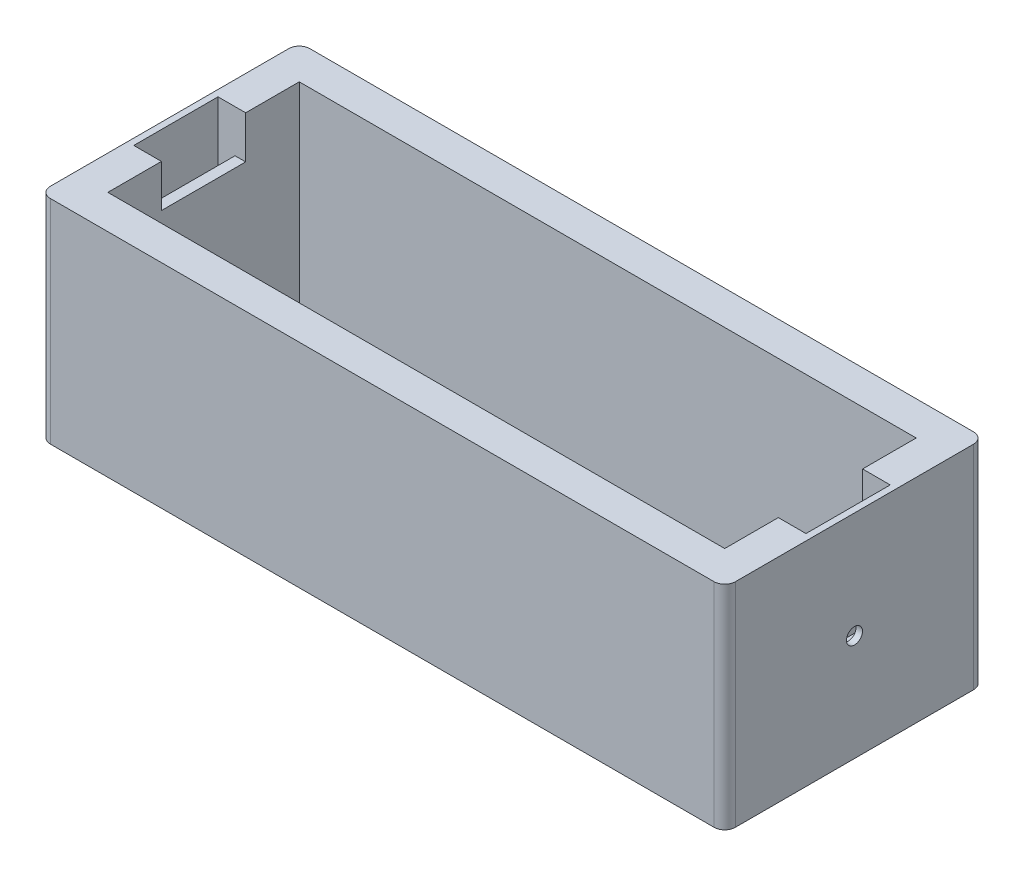
ISO-10303-21;
HEADER;
FILE_DESCRIPTION(('STEP AP214'),'2;1');
FILE_NAME('part.step','',(''),(''),'','','');
FILE_SCHEMA(('AUTOMOTIVE_DESIGN { 1 0 10303 214 1 1 1 1 }'));
ENDSEC;
DATA;
#1=APPLICATION_CONTEXT('core data for automotive mechanical design processes');
#2=APPLICATION_PROTOCOL_DEFINITION('international standard','automotive_design',2000,#1);
#3=PRODUCT_CONTEXT('',#1,'mechanical');
#4=PRODUCT('Part','Part','',(#3));
#5=PRODUCT_RELATED_PRODUCT_CATEGORY('part','',(#4));
#6=PRODUCT_DEFINITION_FORMATION('','',#4);
#7=PRODUCT_DEFINITION_CONTEXT('part definition',#1,'design');
#8=PRODUCT_DEFINITION('design','',#6,#7);
#9=PRODUCT_DEFINITION_SHAPE('','',#8);
#10=(LENGTH_UNIT() NAMED_UNIT(*) SI_UNIT(.MILLI.,.METRE.));
#11=(NAMED_UNIT(*) PLANE_ANGLE_UNIT() SI_UNIT($,.RADIAN.));
#12=(NAMED_UNIT(*) SI_UNIT($,.STERADIAN.) SOLID_ANGLE_UNIT());
#13=UNCERTAINTY_MEASURE_WITH_UNIT(LENGTH_MEASURE(1.E-05),#10,'distance_accuracy_value','');
#14=(GEOMETRIC_REPRESENTATION_CONTEXT(3) GLOBAL_UNCERTAINTY_ASSIGNED_CONTEXT((#13)) GLOBAL_UNIT_ASSIGNED_CONTEXT((#10,
#11,#12)) REPRESENTATION_CONTEXT('',''));
#15=CARTESIAN_POINT('',(0.,0.,0.));
#16=DIRECTION('',(0.,0.,1.));
#17=DIRECTION('',(1.,0.,0.));
#18=AXIS2_PLACEMENT_3D('',#15,#16,#17);
#19=CARTESIAN_POINT('',(0.,20.,0.));
#20=DIRECTION('',(0.,-1.,0.));
#21=DIRECTION('',(0.,0.,-1.));
#22=AXIS2_PLACEMENT_3D('',#19,#20,#21);
#23=PLANE('',#22);
#24=DIRECTION('',(-1.,0.,0.));
#25=VECTOR('',#24,1.);
#26=CARTESIAN_POINT('',(-32.2,20.,-12.2));
#27=LINE('',#26,#25);
#28=CARTESIAN_POINT('',(31.2,20.,-12.2));
#29=VERTEX_POINT('',#28);
#30=CARTESIAN_POINT('',(-31.2,20.,-12.2));
#31=VERTEX_POINT('',#30);
#32=EDGE_CURVE('E350',#29,#31,#27,.T.);
#33=ORIENTED_EDGE('',*,*,#32,.T.);
#34=CARTESIAN_POINT('',(-31.2,20.,-11.2));
#35=DIRECTION('',(0.,-1.,0.));
#36=DIRECTION('',(0.,0.,-1.));
#37=AXIS2_PLACEMENT_3D('',#34,#35,#36);
#38=CIRCLE('',#37,1.);
#39=CARTESIAN_POINT('',(-32.2,20.,-11.2));
#40=VERTEX_POINT('',#39);
#41=EDGE_CURVE('E392',#31,#40,#38,.F.);
#42=ORIENTED_EDGE('',*,*,#41,.T.);
#43=DIRECTION('',(0.,0.,1.));
#44=VECTOR('',#43,1.);
#45=CARTESIAN_POINT('',(-32.2,20.,12.2));
#46=LINE('',#45,#44);
#47=CARTESIAN_POINT('',(-32.2,20.,11.2));
#48=VERTEX_POINT('',#47);
#49=EDGE_CURVE('E354',#40,#48,#46,.T.);
#50=ORIENTED_EDGE('',*,*,#49,.T.);
#51=CARTESIAN_POINT('',(-31.2,20.,11.2));
#52=DIRECTION('',(0.,-1.,0.));
#53=DIRECTION('',(0.,0.,-1.));
#54=AXIS2_PLACEMENT_3D('',#51,#52,#53);
#55=CIRCLE('',#54,1.);
#56=CARTESIAN_POINT('',(-31.2,20.,12.2));
#57=VERTEX_POINT('',#56);
#58=EDGE_CURVE('E386',#48,#57,#55,.F.);
#59=ORIENTED_EDGE('',*,*,#58,.T.);
#60=DIRECTION('',(1.,0.,0.));
#61=VECTOR('',#60,1.);
#62=CARTESIAN_POINT('',(-32.2,20.,12.2));
#63=LINE('',#62,#61);
#64=CARTESIAN_POINT('',(31.2,20.,12.2));
#65=VERTEX_POINT('',#64);
#66=EDGE_CURVE('E357',#57,#65,#63,.T.);
#67=ORIENTED_EDGE('',*,*,#66,.T.);
#68=CARTESIAN_POINT('',(31.2,20.,11.2));
#69=DIRECTION('',(0.,-1.,0.));
#70=DIRECTION('',(0.,0.,-1.));
#71=AXIS2_PLACEMENT_3D('',#68,#69,#70);
#72=CIRCLE('',#71,1.);
#73=CARTESIAN_POINT('',(32.2,20.,11.2));
#74=VERTEX_POINT('',#73);
#75=EDGE_CURVE('E388',#65,#74,#72,.F.);
#76=ORIENTED_EDGE('',*,*,#75,.T.);
#77=DIRECTION('',(0.,0.,-1.));
#78=VECTOR('',#77,1.);
#79=CARTESIAN_POINT('',(32.2,20.,12.2));
#80=LINE('',#79,#78);
#81=CARTESIAN_POINT('',(32.2,20.,-11.2));
#82=VERTEX_POINT('',#81);
#83=EDGE_CURVE('E347',#74,#82,#80,.T.);
#84=ORIENTED_EDGE('',*,*,#83,.T.);
#85=CARTESIAN_POINT('',(31.2,20.,-11.2));
#86=DIRECTION('',(0.,-1.,0.));
#87=DIRECTION('',(0.,0.,-1.));
#88=AXIS2_PLACEMENT_3D('',#85,#86,#87);
#89=CIRCLE('',#88,1.);
#90=EDGE_CURVE('E390',#82,#29,#89,.F.);
#91=ORIENTED_EDGE('',*,*,#90,.T.);
#92=EDGE_LOOP('',(#33,#42,#50,#59,#67,#76,#84,#91));
#93=FACE_BOUND('',#92,.T.);
#94=DIRECTION('',(-1.,0.,0.));
#95=VECTOR('',#94,1.);
#96=CARTESIAN_POINT('',(-29.,20.,3.96));
#97=LINE('',#96,#95);
#98=CARTESIAN_POINT('',(-29.,20.,3.96));
#99=VERTEX_POINT('',#98);
#100=CARTESIAN_POINT('',(-31.6,20.,3.96));
#101=VERTEX_POINT('',#100);
#102=EDGE_CURVE('E241',#99,#101,#97,.T.);
#103=ORIENTED_EDGE('',*,*,#102,.T.);
#104=DIRECTION('',(0.,0.,1.));
#105=VECTOR('',#104,1.);
#106=CARTESIAN_POINT('',(-31.6,20.,0.));
#107=LINE('',#106,#105);
#108=CARTESIAN_POINT('',(-31.6,20.,-3.96));
#109=VERTEX_POINT('',#108);
#110=EDGE_CURVE('E284',#109,#101,#107,.T.);
#111=ORIENTED_EDGE('',*,*,#110,.F.);
#112=DIRECTION('',(-1.,0.,0.));
#113=VECTOR('',#112,1.);
#114=CARTESIAN_POINT('',(-29.,20.,-3.96));
#115=LINE('',#114,#113);
#116=CARTESIAN_POINT('',(-29.,20.,-3.96));
#117=VERTEX_POINT('',#116);
#118=EDGE_CURVE('E298',#117,#109,#115,.T.);
#119=ORIENTED_EDGE('',*,*,#118,.F.);
#120=DIRECTION('',(0.,0.,1.));
#121=VECTOR('',#120,1.);
#122=CARTESIAN_POINT('',(-29.,20.,-9.));
#123=LINE('',#122,#121);
#124=CARTESIAN_POINT('',(-29.,20.,-9.));
#125=VERTEX_POINT('',#124);
#126=EDGE_CURVE('E314',#125,#117,#123,.T.);
#127=ORIENTED_EDGE('',*,*,#126,.F.);
#128=DIRECTION('',(-1.,0.,0.));
#129=VECTOR('',#128,1.);
#130=CARTESIAN_POINT('',(-29.,20.,-9.));
#131=LINE('',#130,#129);
#132=CARTESIAN_POINT('',(29.,20.,-9.));
#133=VERTEX_POINT('',#132);
#134=EDGE_CURVE('E318',#133,#125,#131,.T.);
#135=ORIENTED_EDGE('',*,*,#134,.F.);
#136=DIRECTION('',(0.,0.,-1.));
#137=VECTOR('',#136,1.);
#138=CARTESIAN_POINT('',(29.,20.,-9.));
#139=LINE('',#138,#137);
#140=CARTESIAN_POINT('',(29.,20.,-3.96));
#141=VERTEX_POINT('',#140);
#142=EDGE_CURVE('E310',#141,#133,#139,.T.);
#143=ORIENTED_EDGE('',*,*,#142,.F.);
#144=DIRECTION('',(1.,0.,0.));
#145=VECTOR('',#144,1.);
#146=CARTESIAN_POINT('',(29.,20.,-3.96));
#147=LINE('',#146,#145);
#148=CARTESIAN_POINT('',(31.6,20.,-3.96));
#149=VERTEX_POINT('',#148);
#150=EDGE_CURVE('E279',#141,#149,#147,.T.);
#151=ORIENTED_EDGE('',*,*,#150,.T.);
#152=DIRECTION('',(0.,0.,1.));
#153=VECTOR('',#152,1.);
#154=CARTESIAN_POINT('',(31.6,20.,0.));
#155=LINE('',#154,#153);
#156=CARTESIAN_POINT('',(31.6,20.,3.96));
#157=VERTEX_POINT('',#156);
#158=EDGE_CURVE('E265',#149,#157,#155,.T.);
#159=ORIENTED_EDGE('',*,*,#158,.T.);
#160=DIRECTION('',(1.,0.,0.));
#161=VECTOR('',#160,1.);
#162=CARTESIAN_POINT('',(29.,20.,3.96));
#163=LINE('',#162,#161);
#164=CARTESIAN_POINT('',(29.,20.,3.96));
#165=VERTEX_POINT('',#164);
#166=EDGE_CURVE('E256',#165,#157,#163,.T.);
#167=ORIENTED_EDGE('',*,*,#166,.F.);
#168=CARTESIAN_POINT('',(29.,20.,9.));
#169=VERTEX_POINT('',#168);
#170=EDGE_CURVE('E321',#169,#165,#139,.T.);
#171=ORIENTED_EDGE('',*,*,#170,.F.);
#172=DIRECTION('',(1.,0.,0.));
#173=VECTOR('',#172,1.);
#174=CARTESIAN_POINT('',(-29.,20.,9.));
#175=LINE('',#174,#173);
#176=CARTESIAN_POINT('',(-29.,20.,9.));
#177=VERTEX_POINT('',#176);
#178=EDGE_CURVE('E311',#177,#169,#175,.T.);
#179=ORIENTED_EDGE('',*,*,#178,.F.);
#180=EDGE_CURVE('E317',#99,#177,#123,.T.);
#181=ORIENTED_EDGE('',*,*,#180,.F.);
#182=EDGE_LOOP('',(#103,#111,#119,#127,#135,#143,#151,#159,#167,#171,#179,#181));
#183=FACE_BOUND('',#182,.T.);
#184=ADVANCED_FACE('F45',(#93,#183),#23,.F.);
#185=CARTESIAN_POINT('',(-29.,-60.7289058027559,-9.));
#186=DIRECTION('',(-1.,0.,0.));
#187=DIRECTION('',(0.,0.,1.));
#188=AXIS2_PLACEMENT_3D('',#185,#186,#187);
#189=PLANE('',#188);
#190=DIRECTION('',(0.,1.,0.));
#191=VECTOR('',#190,1.);
#192=CARTESIAN_POINT('',(-29.,7.91568855252198,3.96));
#193=LINE('',#192,#191);
#194=CARTESIAN_POINT('',(-29.,16.,3.96));
#195=VERTEX_POINT('',#194);
#196=EDGE_CURVE('E226',#195,#99,#193,.T.);
#197=ORIENTED_EDGE('',*,*,#196,.T.);
#198=ORIENTED_EDGE('',*,*,#180,.T.);
#199=DIRECTION('',(0.,1.,0.));
#200=VECTOR('',#199,1.);
#201=CARTESIAN_POINT('',(-29.,-60.7289058027559,9.));
#202=LINE('',#201,#200);
#203=CARTESIAN_POINT('',(-29.,2.,9.));
#204=VERTEX_POINT('',#203);
#205=EDGE_CURVE('E335',#204,#177,#202,.T.);
#206=ORIENTED_EDGE('',*,*,#205,.F.);
#207=DIRECTION('',(0.,0.,1.));
#208=VECTOR('',#207,1.);
#209=CARTESIAN_POINT('',(-29.,2.,-9.));
#210=LINE('',#209,#208);
#211=CARTESIAN_POINT('',(-29.,2.,-9.));
#212=VERTEX_POINT('',#211);
#213=EDGE_CURVE('E336',#212,#204,#210,.T.);
#214=ORIENTED_EDGE('',*,*,#213,.F.);
#215=DIRECTION('',(0.,1.,0.));
#216=VECTOR('',#215,1.);
#217=CARTESIAN_POINT('',(-29.,-60.7289058027559,-9.));
#218=LINE('',#217,#216);
#219=EDGE_CURVE('E326',#212,#125,#218,.T.);
#220=ORIENTED_EDGE('',*,*,#219,.T.);
#221=ORIENTED_EDGE('',*,*,#126,.T.);
#222=DIRECTION('',(0.,1.,0.));
#223=VECTOR('',#222,1.);
#224=CARTESIAN_POINT('',(-29.,7.91568855252198,-3.96));
#225=LINE('',#224,#223);
#226=CARTESIAN_POINT('',(-29.,16.,-3.96));
#227=VERTEX_POINT('',#226);
#228=EDGE_CURVE('E307',#227,#117,#225,.T.);
#229=ORIENTED_EDGE('',*,*,#228,.F.);
#230=DIRECTION('',(0.,0.,-1.));
#231=VECTOR('',#230,1.);
#232=CARTESIAN_POINT('',(-29.,16.,0.));
#233=LINE('',#232,#231);
#234=EDGE_CURVE('E304',#195,#227,#233,.T.);
#235=ORIENTED_EDGE('',*,*,#234,.F.);
#236=EDGE_LOOP('',(#197,#198,#206,#214,#220,#221,#229,#235));
#237=FACE_BOUND('',#236,.T.);
#238=ADVANCED_FACE('F446',(#237),#189,.F.);
#239=CARTESIAN_POINT('',(29.,-60.7289058027559,-9.));
#240=DIRECTION('',(1.,0.,0.));
#241=DIRECTION('',(0.,0.,-1.));
#242=AXIS2_PLACEMENT_3D('',#239,#240,#241);
#243=PLANE('',#242);
#244=DIRECTION('',(0.,1.,0.));
#245=VECTOR('',#244,1.);
#246=CARTESIAN_POINT('',(29.,7.91568855252198,3.96));
#247=LINE('',#246,#245);
#248=CARTESIAN_POINT('',(29.,16.,3.96));
#249=VERTEX_POINT('',#248);
#250=EDGE_CURVE('E262',#249,#165,#247,.T.);
#251=ORIENTED_EDGE('',*,*,#250,.F.);
#252=DIRECTION('',(0.,0.,-1.));
#253=VECTOR('',#252,1.);
#254=CARTESIAN_POINT('',(29.,16.,0.));
#255=LINE('',#254,#253);
#256=CARTESIAN_POINT('',(29.,16.,-3.96));
#257=VERTEX_POINT('',#256);
#258=EDGE_CURVE('E281',#249,#257,#255,.T.);
#259=ORIENTED_EDGE('',*,*,#258,.T.);
#260=DIRECTION('',(0.,1.,0.));
#261=VECTOR('',#260,1.);
#262=CARTESIAN_POINT('',(29.,7.91568855252198,-3.96));
#263=LINE('',#262,#261);
#264=EDGE_CURVE('E60',#257,#141,#263,.T.);
#265=ORIENTED_EDGE('',*,*,#264,.T.);
#266=ORIENTED_EDGE('',*,*,#142,.T.);
#267=DIRECTION('',(0.,1.,0.));
#268=VECTOR('',#267,1.);
#269=CARTESIAN_POINT('',(29.,-60.7289058027559,-9.));
#270=LINE('',#269,#268);
#271=CARTESIAN_POINT('',(29.,2.,-9.));
#272=VERTEX_POINT('',#271);
#273=EDGE_CURVE('E330',#272,#133,#270,.T.);
#274=ORIENTED_EDGE('',*,*,#273,.F.);
#275=DIRECTION('',(0.,0.,-1.));
#276=VECTOR('',#275,1.);
#277=CARTESIAN_POINT('',(29.,2.,-9.));
#278=LINE('',#277,#276);
#279=CARTESIAN_POINT('',(29.,2.,9.));
#280=VERTEX_POINT('',#279);
#281=EDGE_CURVE('E327',#280,#272,#278,.T.);
#282=ORIENTED_EDGE('',*,*,#281,.F.);
#283=DIRECTION('',(0.,1.,0.));
#284=VECTOR('',#283,1.);
#285=CARTESIAN_POINT('',(29.,-60.7289058027559,9.));
#286=LINE('',#285,#284);
#287=EDGE_CURVE('E331',#280,#169,#286,.T.);
#288=ORIENTED_EDGE('',*,*,#287,.T.);
#289=ORIENTED_EDGE('',*,*,#170,.T.);
#290=EDGE_LOOP('',(#251,#259,#265,#266,#274,#282,#288,#289));
#291=FACE_BOUND('',#290,.T.);
#292=ADVANCED_FACE('F452',(#291),#243,.F.);
#293=CARTESIAN_POINT('',(32.2,20.,12.2));
#294=DIRECTION('',(-1.,0.,0.));
#295=DIRECTION('',(0.,0.,1.));
#296=AXIS2_PLACEMENT_3D('',#293,#294,#295);
#297=PLANE('',#296);
#298=CARTESIAN_POINT('',(32.2,10.,0.));
#299=DIRECTION('',(1.,0.,0.));
#300=DIRECTION('',(0.,0.,-1.));
#301=AXIS2_PLACEMENT_3D('',#298,#299,#300);
#302=CIRCLE('',#301,0.75);
#303=CARTESIAN_POINT('',(32.2,10.,-0.75));
#304=VERTEX_POINT('',#303);
#305=EDGE_CURVE('E237',#304,#304,#302,.T.);
#306=ORIENTED_EDGE('',*,*,#305,.F.);
#307=EDGE_LOOP('',(#306));
#308=FACE_BOUND('',#307,.T.);
#309=DIRECTION('',(0.,0.,-1.));
#310=VECTOR('',#309,1.);
#311=CARTESIAN_POINT('',(32.2,0.,12.2));
#312=LINE('',#311,#310);
#313=CARTESIAN_POINT('',(32.2,0.,11.2));
#314=VERTEX_POINT('',#313);
#315=CARTESIAN_POINT('',(32.2,0.,-11.2));
#316=VERTEX_POINT('',#315);
#317=EDGE_CURVE('E346',#314,#316,#312,.T.);
#318=ORIENTED_EDGE('',*,*,#317,.T.);
#319=DIRECTION('',(0.,-1.,0.));
#320=VECTOR('',#319,1.);
#321=CARTESIAN_POINT('',(32.2,20.,-11.2));
#322=LINE('',#321,#320);
#323=EDGE_CURVE('E397',#316,#82,#322,.F.);
#324=ORIENTED_EDGE('',*,*,#323,.T.);
#325=ORIENTED_EDGE('',*,*,#83,.F.);
#326=DIRECTION('',(0.,-1.,0.));
#327=VECTOR('',#326,1.);
#328=CARTESIAN_POINT('',(32.2,20.,11.2));
#329=LINE('',#328,#327);
#330=EDGE_CURVE('E394',#74,#314,#329,.T.);
#331=ORIENTED_EDGE('',*,*,#330,.T.);
#332=EDGE_LOOP('',(#318,#324,#325,#331));
#333=FACE_BOUND('',#332,.T.);
#334=ADVANCED_FACE('F414',(#308,#333),#297,.F.);
#335=CARTESIAN_POINT('',(-32.2,20.,-12.2));
#336=DIRECTION('',(0.,0.,1.));
#337=DIRECTION('',(1.,0.,0.));
#338=AXIS2_PLACEMENT_3D('',#335,#336,#337);
#339=PLANE('',#338);
#340=DIRECTION('',(-1.,0.,0.));
#341=VECTOR('',#340,1.);
#342=CARTESIAN_POINT('',(-32.2,0.,-12.2));
#343=LINE('',#342,#341);
#344=CARTESIAN_POINT('',(31.2,0.,-12.2));
#345=VERTEX_POINT('',#344);
#346=CARTESIAN_POINT('',(-31.2,0.,-12.2));
#347=VERTEX_POINT('',#346);
#348=EDGE_CURVE('E362',#345,#347,#343,.T.);
#349=ORIENTED_EDGE('',*,*,#348,.T.);
#350=DIRECTION('',(0.,-1.,0.));
#351=VECTOR('',#350,1.);
#352=CARTESIAN_POINT('',(-31.2,20.,-12.2));
#353=LINE('',#352,#351);
#354=EDGE_CURVE('E384',#347,#31,#353,.F.);
#355=ORIENTED_EDGE('',*,*,#354,.T.);
#356=ORIENTED_EDGE('',*,*,#32,.F.);
#357=DIRECTION('',(0.,-1.,0.));
#358=VECTOR('',#357,1.);
#359=CARTESIAN_POINT('',(31.2,20.,-12.2));
#360=LINE('',#359,#358);
#361=EDGE_CURVE('E381',#29,#345,#360,.T.);
#362=ORIENTED_EDGE('',*,*,#361,.T.);
#363=EDGE_LOOP('',(#349,#355,#356,#362));
#364=FACE_BOUND('',#363,.T.);
#365=ADVANCED_FACE('F425',(#364),#339,.F.);
#366=CARTESIAN_POINT('',(-32.2,20.,12.2));
#367=DIRECTION('',(1.,0.,0.));
#368=DIRECTION('',(0.,0.,-1.));
#369=AXIS2_PLACEMENT_3D('',#366,#367,#368);
#370=PLANE('',#369);
#371=CARTESIAN_POINT('',(-32.2,10.,0.));
#372=DIRECTION('',(1.,0.,0.));
#373=DIRECTION('',(0.,0.,-1.));
#374=AXIS2_PLACEMENT_3D('',#371,#372,#373);
#375=CIRCLE('',#374,0.75);
#376=CARTESIAN_POINT('',(-32.2,10.,-0.75));
#377=VERTEX_POINT('',#376);
#378=EDGE_CURVE('E759',#377,#377,#375,.T.);
#379=ORIENTED_EDGE('',*,*,#378,.T.);
#380=EDGE_LOOP('',(#379));
#381=FACE_BOUND('',#380,.T.);
#382=ORIENTED_EDGE('',*,*,#49,.F.);
#383=DIRECTION('',(0.,-1.,0.));
#384=VECTOR('',#383,1.);
#385=CARTESIAN_POINT('',(-32.2,20.,-11.2));
#386=LINE('',#385,#384);
#387=CARTESIAN_POINT('',(-32.2,0.,-11.2));
#388=VERTEX_POINT('',#387);
#389=EDGE_CURVE('E370',#40,#388,#386,.T.);
#390=ORIENTED_EDGE('',*,*,#389,.T.);
#391=DIRECTION('',(0.,0.,1.));
#392=VECTOR('',#391,1.);
#393=CARTESIAN_POINT('',(-32.2,0.,12.2));
#394=LINE('',#393,#392);
#395=CARTESIAN_POINT('',(-32.2,0.,11.2));
#396=VERTEX_POINT('',#395);
#397=EDGE_CURVE('E365',#388,#396,#394,.T.);
#398=ORIENTED_EDGE('',*,*,#397,.T.);
#399=DIRECTION('',(0.,-1.,0.));
#400=VECTOR('',#399,1.);
#401=CARTESIAN_POINT('',(-32.2,20.,11.2));
#402=LINE('',#401,#400);
#403=EDGE_CURVE('E359',#396,#48,#402,.F.);
#404=ORIENTED_EDGE('',*,*,#403,.T.);
#405=EDGE_LOOP('',(#382,#390,#398,#404));
#406=FACE_BOUND('',#405,.T.);
#407=ADVANCED_FACE('F433',(#381,#406),#370,.F.);
#408=CARTESIAN_POINT('',(-32.2,20.,12.2));
#409=DIRECTION('',(0.,0.,-1.));
#410=DIRECTION('',(-1.,0.,0.));
#411=AXIS2_PLACEMENT_3D('',#408,#409,#410);
#412=PLANE('',#411);
#413=DIRECTION('',(1.,0.,0.));
#414=VECTOR('',#413,1.);
#415=CARTESIAN_POINT('',(-32.2,0.,12.2));
#416=LINE('',#415,#414);
#417=CARTESIAN_POINT('',(-31.2,0.,12.2));
#418=VERTEX_POINT('',#417);
#419=CARTESIAN_POINT('',(31.2,0.,12.2));
#420=VERTEX_POINT('',#419);
#421=EDGE_CURVE('E351',#418,#420,#416,.T.);
#422=ORIENTED_EDGE('',*,*,#421,.T.);
#423=DIRECTION('',(0.,-1.,0.));
#424=VECTOR('',#423,1.);
#425=CARTESIAN_POINT('',(31.2,20.,12.2));
#426=LINE('',#425,#424);
#427=EDGE_CURVE('E12',#420,#65,#426,.F.);
#428=ORIENTED_EDGE('',*,*,#427,.T.);
#429=ORIENTED_EDGE('',*,*,#66,.F.);
#430=DIRECTION('',(0.,-1.,0.));
#431=VECTOR('',#430,1.);
#432=CARTESIAN_POINT('',(-31.2,20.,12.2));
#433=LINE('',#432,#431);
#434=EDGE_CURVE('E53',#57,#418,#433,.T.);
#435=ORIENTED_EDGE('',*,*,#434,.T.);
#436=EDGE_LOOP('',(#422,#428,#429,#435));
#437=FACE_BOUND('',#436,.T.);
#438=ADVANCED_FACE('F401',(#437),#412,.F.);
#439=CARTESIAN_POINT('',(0.,0.,0.));
#440=DIRECTION('',(0.,-1.,0.));
#441=DIRECTION('',(0.,0.,-1.));
#442=AXIS2_PLACEMENT_3D('',#439,#440,#441);
#443=PLANE('',#442);
#444=ORIENTED_EDGE('',*,*,#397,.F.);
#445=CARTESIAN_POINT('',(-31.2,0.,-11.2));
#446=DIRECTION('',(0.,-1.,0.));
#447=DIRECTION('',(0.,0.,-1.));
#448=AXIS2_PLACEMENT_3D('',#445,#446,#447);
#449=CIRCLE('',#448,1.);
#450=EDGE_CURVE('E379',#388,#347,#449,.T.);
#451=ORIENTED_EDGE('',*,*,#450,.T.);
#452=ORIENTED_EDGE('',*,*,#348,.F.);
#453=CARTESIAN_POINT('',(31.2,0.,-11.2));
#454=DIRECTION('',(0.,-1.,0.));
#455=DIRECTION('',(0.,0.,-1.));
#456=AXIS2_PLACEMENT_3D('',#453,#454,#455);
#457=CIRCLE('',#456,1.);
#458=EDGE_CURVE('E377',#345,#316,#457,.T.);
#459=ORIENTED_EDGE('',*,*,#458,.T.);
#460=ORIENTED_EDGE('',*,*,#317,.F.);
#461=CARTESIAN_POINT('',(31.2,0.,11.2));
#462=DIRECTION('',(0.,-1.,0.));
#463=DIRECTION('',(0.,0.,-1.));
#464=AXIS2_PLACEMENT_3D('',#461,#462,#463);
#465=CIRCLE('',#464,1.);
#466=EDGE_CURVE('E375',#314,#420,#465,.T.);
#467=ORIENTED_EDGE('',*,*,#466,.T.);
#468=ORIENTED_EDGE('',*,*,#421,.F.);
#469=CARTESIAN_POINT('',(-31.2,0.,11.2));
#470=DIRECTION('',(0.,-1.,0.));
#471=DIRECTION('',(0.,0.,-1.));
#472=AXIS2_PLACEMENT_3D('',#469,#470,#471);
#473=CIRCLE('',#472,1.);
#474=EDGE_CURVE('E373',#418,#396,#473,.T.);
#475=ORIENTED_EDGE('',*,*,#474,.T.);
#476=EDGE_LOOP('',(#444,#451,#452,#459,#460,#467,#468,#475));
#477=FACE_BOUND('',#476,.T.);
#478=ADVANCED_FACE('F406',(#477),#443,.T.);
#479=CARTESIAN_POINT('',(0.,2.,0.));
#480=DIRECTION('',(0.,-1.,0.));
#481=DIRECTION('',(0.,0.,-1.));
#482=AXIS2_PLACEMENT_3D('',#479,#480,#481);
#483=PLANE('',#482);
#484=ORIENTED_EDGE('',*,*,#281,.T.);
#485=DIRECTION('',(-1.,0.,0.));
#486=VECTOR('',#485,1.);
#487=CARTESIAN_POINT('',(-29.,2.,-9.));
#488=LINE('',#487,#486);
#489=EDGE_CURVE('E313',#272,#212,#488,.T.);
#490=ORIENTED_EDGE('',*,*,#489,.T.);
#491=ORIENTED_EDGE('',*,*,#213,.T.);
#492=DIRECTION('',(1.,0.,0.));
#493=VECTOR('',#492,1.);
#494=CARTESIAN_POINT('',(-29.,2.,9.));
#495=LINE('',#494,#493);
#496=EDGE_CURVE('E332',#204,#280,#495,.T.);
#497=ORIENTED_EDGE('',*,*,#496,.T.);
#498=EDGE_LOOP('',(#484,#490,#491,#497));
#499=FACE_BOUND('',#498,.T.);
#500=ADVANCED_FACE('F457',(#499),#483,.F.);
#501=CARTESIAN_POINT('',(-29.,-60.7289058027559,-9.));
#502=DIRECTION('',(0.,0.,-1.));
#503=DIRECTION('',(-1.,0.,0.));
#504=AXIS2_PLACEMENT_3D('',#501,#502,#503);
#505=PLANE('',#504);
#506=ORIENTED_EDGE('',*,*,#273,.T.);
#507=ORIENTED_EDGE('',*,*,#134,.T.);
#508=ORIENTED_EDGE('',*,*,#219,.F.);
#509=ORIENTED_EDGE('',*,*,#489,.F.);
#510=EDGE_LOOP('',(#506,#507,#508,#509));
#511=FACE_BOUND('',#510,.T.);
#512=ADVANCED_FACE('F682',(#511),#505,.F.);
#513=CARTESIAN_POINT('',(-29.,-60.7289058027559,9.));
#514=DIRECTION('',(0.,0.,1.));
#515=DIRECTION('',(1.,0.,0.));
#516=AXIS2_PLACEMENT_3D('',#513,#514,#515);
#517=PLANE('',#516);
#518=ORIENTED_EDGE('',*,*,#205,.T.);
#519=ORIENTED_EDGE('',*,*,#178,.T.);
#520=ORIENTED_EDGE('',*,*,#287,.F.);
#521=ORIENTED_EDGE('',*,*,#496,.F.);
#522=EDGE_LOOP('',(#518,#519,#520,#521));
#523=FACE_BOUND('',#522,.T.);
#524=ADVANCED_FACE('F473',(#523),#517,.F.);
#525=CARTESIAN_POINT('',(-31.2,20.,-11.2));
#526=DIRECTION('',(0.,-1.,0.));
#527=DIRECTION('',(0.,0.,-1.));
#528=AXIS2_PLACEMENT_3D('',#525,#526,#527);
#529=CYLINDRICAL_SURFACE('',#528,1.);
#530=ORIENTED_EDGE('',*,*,#41,.F.);
#531=ORIENTED_EDGE('',*,*,#354,.F.);
#532=ORIENTED_EDGE('',*,*,#450,.F.);
#533=ORIENTED_EDGE('',*,*,#389,.F.);
#534=EDGE_LOOP('',(#530,#531,#532,#533));
#535=FACE_BOUND('',#534,.T.);
#536=ADVANCED_FACE('F430',(#535),#529,.T.);
#537=CARTESIAN_POINT('',(31.2,20.,-11.2));
#538=DIRECTION('',(0.,-1.,0.));
#539=DIRECTION('',(0.,0.,-1.));
#540=AXIS2_PLACEMENT_3D('',#537,#538,#539);
#541=CYLINDRICAL_SURFACE('',#540,1.);
#542=ORIENTED_EDGE('',*,*,#90,.F.);
#543=ORIENTED_EDGE('',*,*,#323,.F.);
#544=ORIENTED_EDGE('',*,*,#458,.F.);
#545=ORIENTED_EDGE('',*,*,#361,.F.);
#546=EDGE_LOOP('',(#542,#543,#544,#545));
#547=FACE_BOUND('',#546,.T.);
#548=ADVANCED_FACE('F422',(#547),#541,.T.);
#549=CARTESIAN_POINT('',(31.2,20.,11.2));
#550=DIRECTION('',(0.,-1.,0.));
#551=DIRECTION('',(0.,0.,-1.));
#552=AXIS2_PLACEMENT_3D('',#549,#550,#551);
#553=CYLINDRICAL_SURFACE('',#552,1.);
#554=ORIENTED_EDGE('',*,*,#75,.F.);
#555=ORIENTED_EDGE('',*,*,#427,.F.);
#556=ORIENTED_EDGE('',*,*,#466,.F.);
#557=ORIENTED_EDGE('',*,*,#330,.F.);
#558=EDGE_LOOP('',(#554,#555,#556,#557));
#559=FACE_BOUND('',#558,.T.);
#560=ADVANCED_FACE('F411',(#559),#553,.T.);
#561=CARTESIAN_POINT('',(-31.2,20.,11.2));
#562=DIRECTION('',(0.,-1.,0.));
#563=DIRECTION('',(0.,0.,-1.));
#564=AXIS2_PLACEMENT_3D('',#561,#562,#563);
#565=CYLINDRICAL_SURFACE('',#564,1.);
#566=ORIENTED_EDGE('',*,*,#58,.F.);
#567=ORIENTED_EDGE('',*,*,#403,.F.);
#568=ORIENTED_EDGE('',*,*,#474,.F.);
#569=ORIENTED_EDGE('',*,*,#434,.F.);
#570=EDGE_LOOP('',(#566,#567,#568,#569));
#571=FACE_BOUND('',#570,.T.);
#572=ADVANCED_FACE('F47',(#571),#565,.T.);
#573=CARTESIAN_POINT('',(0.,16.,0.));
#574=DIRECTION('',(0.,-1.,0.));
#575=DIRECTION('',(0.,0.,-1.));
#576=AXIS2_PLACEMENT_3D('',#573,#574,#575);
#577=PLANE('',#576);
#578=ORIENTED_EDGE('',*,*,#234,.T.);
#579=DIRECTION('',(-1.,0.,0.));
#580=VECTOR('',#579,1.);
#581=CARTESIAN_POINT('',(-29.,16.,-3.96));
#582=LINE('',#581,#580);
#583=CARTESIAN_POINT('',(-30.,16.,-3.96));
#584=VERTEX_POINT('',#583);
#585=EDGE_CURVE('E300',#227,#584,#582,.T.);
#586=ORIENTED_EDGE('',*,*,#585,.T.);
#587=DIRECTION('',(0.,0.,1.));
#588=VECTOR('',#587,1.);
#589=CARTESIAN_POINT('',(-30.,16.,0.));
#590=LINE('',#589,#588);
#591=CARTESIAN_POINT('',(-30.,16.,3.96));
#592=VERTEX_POINT('',#591);
#593=EDGE_CURVE('E303',#584,#592,#590,.T.);
#594=ORIENTED_EDGE('',*,*,#593,.T.);
#595=DIRECTION('',(-1.,0.,0.));
#596=VECTOR('',#595,1.);
#597=CARTESIAN_POINT('',(-29.,16.,3.96));
#598=LINE('',#597,#596);
#599=EDGE_CURVE('E232',#195,#592,#598,.T.);
#600=ORIENTED_EDGE('',*,*,#599,.F.);
#601=EDGE_LOOP('',(#578,#586,#594,#600));
#602=FACE_BOUND('',#601,.T.);
#603=ADVANCED_FACE('F436',(#602),#577,.F.);
#604=CARTESIAN_POINT('',(-29.,7.91568855252198,-3.96));
#605=DIRECTION('',(0.,0.,-1.));
#606=DIRECTION('',(-1.,0.,0.));
#607=AXIS2_PLACEMENT_3D('',#604,#605,#606);
#608=PLANE('',#607);
#609=ORIENTED_EDGE('',*,*,#228,.T.);
#610=ORIENTED_EDGE('',*,*,#118,.T.);
#611=DIRECTION('',(0.,1.,0.));
#612=VECTOR('',#611,1.);
#613=CARTESIAN_POINT('',(-31.6,-8.27101861386719,-3.96));
#614=LINE('',#613,#612);
#615=CARTESIAN_POINT('',(-31.6,8.,-3.96));
#616=VERTEX_POINT('',#615);
#617=EDGE_CURVE('E292',#616,#109,#614,.T.);
#618=ORIENTED_EDGE('',*,*,#617,.F.);
#619=DIRECTION('',(-1.,0.,0.));
#620=VECTOR('',#619,1.);
#621=CARTESIAN_POINT('',(-30.,8.,-3.96));
#622=LINE('',#621,#620);
#623=CARTESIAN_POINT('',(-30.,8.,-3.96));
#624=VERTEX_POINT('',#623);
#625=EDGE_CURVE('E291',#624,#616,#622,.T.);
#626=ORIENTED_EDGE('',*,*,#625,.F.);
#627=DIRECTION('',(0.,1.,0.));
#628=VECTOR('',#627,1.);
#629=CARTESIAN_POINT('',(-30.,-8.27101861386719,-3.96));
#630=LINE('',#629,#628);
#631=EDGE_CURVE('E215',#624,#584,#630,.T.);
#632=ORIENTED_EDGE('',*,*,#631,.T.);
#633=ORIENTED_EDGE('',*,*,#585,.F.);
#634=EDGE_LOOP('',(#609,#610,#618,#626,#632,#633));
#635=FACE_BOUND('',#634,.T.);
#636=ADVANCED_FACE('F442',(#635),#608,.F.);
#637=CARTESIAN_POINT('',(-30.,-8.27101861386719,0.));
#638=DIRECTION('',(1.,0.,0.));
#639=DIRECTION('',(0.,0.,-1.));
#640=AXIS2_PLACEMENT_3D('',#637,#638,#639);
#641=PLANE('',#640);
#642=ORIENTED_EDGE('',*,*,#631,.F.);
#643=DIRECTION('',(0.,0.,-1.));
#644=VECTOR('',#643,1.);
#645=CARTESIAN_POINT('',(-30.,8.,0.));
#646=LINE('',#645,#644);
#647=CARTESIAN_POINT('',(-30.,8.,3.96));
#648=VERTEX_POINT('',#647);
#649=EDGE_CURVE('E208',#648,#624,#646,.T.);
#650=ORIENTED_EDGE('',*,*,#649,.F.);
#651=DIRECTION('',(0.,1.,0.));
#652=VECTOR('',#651,1.);
#653=CARTESIAN_POINT('',(-30.,-8.27101861386719,3.96));
#654=LINE('',#653,#652);
#655=EDGE_CURVE('E212',#648,#592,#654,.T.);
#656=ORIENTED_EDGE('',*,*,#655,.T.);
#657=ORIENTED_EDGE('',*,*,#593,.F.);
#658=EDGE_LOOP('',(#642,#650,#656,#657));
#659=FACE_BOUND('',#658,.T.);
#660=ADVANCED_FACE('F210',(#659),#641,.F.);
#661=CARTESIAN_POINT('',(0.,8.,0.));
#662=DIRECTION('',(0.,-1.,0.));
#663=DIRECTION('',(0.,0.,-1.));
#664=AXIS2_PLACEMENT_3D('',#661,#662,#663);
#665=PLANE('',#664);
#666=ORIENTED_EDGE('',*,*,#649,.T.);
#667=ORIENTED_EDGE('',*,*,#625,.T.);
#668=DIRECTION('',(0.,0.,1.));
#669=VECTOR('',#668,1.);
#670=CARTESIAN_POINT('',(-31.6,8.,0.));
#671=LINE('',#670,#669);
#672=CARTESIAN_POINT('',(-31.6,8.,3.96));
#673=VERTEX_POINT('',#672);
#674=EDGE_CURVE('E218',#616,#673,#671,.T.);
#675=ORIENTED_EDGE('',*,*,#674,.T.);
#676=DIRECTION('',(-1.,0.,0.));
#677=VECTOR('',#676,1.);
#678=CARTESIAN_POINT('',(-30.,8.,3.96));
#679=LINE('',#678,#677);
#680=EDGE_CURVE('E221',#648,#673,#679,.T.);
#681=ORIENTED_EDGE('',*,*,#680,.F.);
#682=EDGE_LOOP('',(#666,#667,#675,#681));
#683=FACE_BOUND('',#682,.T.);
#684=ADVANCED_FACE('F222',(#683),#665,.F.);
#685=CARTESIAN_POINT('',(-31.6,-8.27101861386719,0.));
#686=DIRECTION('',(-1.,0.,0.));
#687=DIRECTION('',(0.,0.,1.));
#688=AXIS2_PLACEMENT_3D('',#685,#686,#687);
#689=PLANE('',#688);
#690=CARTESIAN_POINT('',(-31.6,10.,0.));
#691=DIRECTION('',(-1.,0.,0.));
#692=DIRECTION('',(0.,0.,1.));
#693=AXIS2_PLACEMENT_3D('',#690,#691,#692);
#694=CIRCLE('',#693,0.75);
#695=CARTESIAN_POINT('',(-31.6,10.,0.75));
#696=VERTEX_POINT('',#695);
#697=EDGE_CURVE('E761',#696,#696,#694,.T.);
#698=ORIENTED_EDGE('',*,*,#697,.T.);
#699=EDGE_LOOP('',(#698));
#700=FACE_BOUND('',#699,.T.);
#701=ORIENTED_EDGE('',*,*,#617,.T.);
#702=ORIENTED_EDGE('',*,*,#110,.T.);
#703=DIRECTION('',(0.,1.,0.));
#704=VECTOR('',#703,1.);
#705=CARTESIAN_POINT('',(-31.6,-8.27101861386719,3.96));
#706=LINE('',#705,#704);
#707=EDGE_CURVE('E227',#673,#101,#706,.T.);
#708=ORIENTED_EDGE('',*,*,#707,.F.);
#709=ORIENTED_EDGE('',*,*,#674,.F.);
#710=EDGE_LOOP('',(#701,#702,#708,#709));
#711=FACE_BOUND('',#710,.T.);
#712=ADVANCED_FACE('F530',(#700,#711),#689,.F.);
#713=CARTESIAN_POINT('',(29.,7.91568855252198,-3.96));
#714=DIRECTION('',(0.,0.,1.));
#715=DIRECTION('',(1.,0.,0.));
#716=AXIS2_PLACEMENT_3D('',#713,#714,#715);
#717=PLANE('',#716);
#718=DIRECTION('',(1.,0.,0.));
#719=VECTOR('',#718,1.);
#720=CARTESIAN_POINT('',(29.,16.,-3.96));
#721=LINE('',#720,#719);
#722=CARTESIAN_POINT('',(30.,16.,-3.96));
#723=VERTEX_POINT('',#722);
#724=EDGE_CURVE('E285',#257,#723,#721,.T.);
#725=ORIENTED_EDGE('',*,*,#724,.T.);
#726=DIRECTION('',(0.,1.,0.));
#727=VECTOR('',#726,1.);
#728=CARTESIAN_POINT('',(30.,-8.27101861386719,-3.96));
#729=LINE('',#728,#727);
#730=CARTESIAN_POINT('',(30.,8.,-3.96));
#731=VERTEX_POINT('',#730);
#732=EDGE_CURVE('E264',#731,#723,#729,.T.);
#733=ORIENTED_EDGE('',*,*,#732,.F.);
#734=DIRECTION('',(1.,0.,0.));
#735=VECTOR('',#734,1.);
#736=CARTESIAN_POINT('',(30.,8.,-3.96));
#737=LINE('',#736,#735);
#738=CARTESIAN_POINT('',(31.6,8.,-3.96));
#739=VERTEX_POINT('',#738);
#740=EDGE_CURVE('E271',#731,#739,#737,.T.);
#741=ORIENTED_EDGE('',*,*,#740,.T.);
#742=DIRECTION('',(0.,1.,0.));
#743=VECTOR('',#742,1.);
#744=CARTESIAN_POINT('',(31.6,-8.27101861386719,-3.96));
#745=LINE('',#744,#743);
#746=EDGE_CURVE('E268',#739,#149,#745,.T.);
#747=ORIENTED_EDGE('',*,*,#746,.T.);
#748=ORIENTED_EDGE('',*,*,#150,.F.);
#749=ORIENTED_EDGE('',*,*,#264,.F.);
#750=EDGE_LOOP('',(#725,#733,#741,#747,#748,#749));
#751=FACE_BOUND('',#750,.T.);
#752=ADVANCED_FACE('F541',(#751),#717,.T.);
#753=CARTESIAN_POINT('',(0.,16.,0.));
#754=DIRECTION('',(0.,-1.,0.));
#755=DIRECTION('',(0.,0.,-1.));
#756=AXIS2_PLACEMENT_3D('',#753,#754,#755);
#757=PLANE('',#756);
#758=ORIENTED_EDGE('',*,*,#258,.F.);
#759=DIRECTION('',(1.,0.,0.));
#760=VECTOR('',#759,1.);
#761=CARTESIAN_POINT('',(29.,16.,3.96));
#762=LINE('',#761,#760);
#763=CARTESIAN_POINT('',(30.,16.,3.96));
#764=VERTEX_POINT('',#763);
#765=EDGE_CURVE('E259',#249,#764,#762,.T.);
#766=ORIENTED_EDGE('',*,*,#765,.T.);
#767=DIRECTION('',(0.,0.,1.));
#768=VECTOR('',#767,1.);
#769=CARTESIAN_POINT('',(30.,16.,0.));
#770=LINE('',#769,#768);
#771=EDGE_CURVE('E282',#723,#764,#770,.T.);
#772=ORIENTED_EDGE('',*,*,#771,.F.);
#773=ORIENTED_EDGE('',*,*,#724,.F.);
#774=EDGE_LOOP('',(#758,#766,#772,#773));
#775=FACE_BOUND('',#774,.T.);
#776=ADVANCED_FACE('F561',(#775),#757,.F.);
#777=CARTESIAN_POINT('',(30.,-8.27101861386719,0.));
#778=DIRECTION('',(1.,0.,0.));
#779=DIRECTION('',(0.,0.,-1.));
#780=AXIS2_PLACEMENT_3D('',#777,#778,#779);
#781=PLANE('',#780);
#782=ORIENTED_EDGE('',*,*,#771,.T.);
#783=DIRECTION('',(0.,1.,0.));
#784=VECTOR('',#783,1.);
#785=CARTESIAN_POINT('',(30.,-8.27101861386719,3.96));
#786=LINE('',#785,#784);
#787=CARTESIAN_POINT('',(30.,8.,3.96));
#788=VERTEX_POINT('',#787);
#789=EDGE_CURVE('E253',#788,#764,#786,.T.);
#790=ORIENTED_EDGE('',*,*,#789,.F.);
#791=DIRECTION('',(0.,0.,-1.));
#792=VECTOR('',#791,1.);
#793=CARTESIAN_POINT('',(30.,8.,0.));
#794=LINE('',#793,#792);
#795=EDGE_CURVE('E267',#788,#731,#794,.T.);
#796=ORIENTED_EDGE('',*,*,#795,.T.);
#797=ORIENTED_EDGE('',*,*,#732,.T.);
#798=EDGE_LOOP('',(#782,#790,#796,#797));
#799=FACE_BOUND('',#798,.T.);
#800=ADVANCED_FACE('F572',(#799),#781,.T.);
#801=CARTESIAN_POINT('',(31.6,-8.27101861386719,0.));
#802=DIRECTION('',(-1.,0.,0.));
#803=DIRECTION('',(0.,0.,1.));
#804=AXIS2_PLACEMENT_3D('',#801,#802,#803);
#805=PLANE('',#804);
#806=CARTESIAN_POINT('',(31.6,10.,0.));
#807=DIRECTION('',(-1.,0.,0.));
#808=DIRECTION('',(0.,0.,1.));
#809=AXIS2_PLACEMENT_3D('',#806,#807,#808);
#810=CIRCLE('',#809,0.75);
#811=CARTESIAN_POINT('',(31.6,10.,-0.75));
#812=VERTEX_POINT('',#811);
#813=EDGE_CURVE('E233',#812,#812,#810,.F.);
#814=ORIENTED_EDGE('',*,*,#813,.T.);
#815=EDGE_LOOP('',(#814));
#816=FACE_BOUND('',#815,.T.);
#817=DIRECTION('',(0.,0.,1.));
#818=VECTOR('',#817,1.);
#819=CARTESIAN_POINT('',(31.6,8.,0.));
#820=LINE('',#819,#818);
#821=CARTESIAN_POINT('',(31.6,8.,3.96));
#822=VERTEX_POINT('',#821);
#823=EDGE_CURVE('E269',#739,#822,#820,.T.);
#824=ORIENTED_EDGE('',*,*,#823,.T.);
#825=DIRECTION('',(0.,1.,0.));
#826=VECTOR('',#825,1.);
#827=CARTESIAN_POINT('',(31.6,-8.27101861386719,3.96));
#828=LINE('',#827,#826);
#829=EDGE_CURVE('E250',#822,#157,#828,.T.);
#830=ORIENTED_EDGE('',*,*,#829,.T.);
#831=ORIENTED_EDGE('',*,*,#158,.F.);
#832=ORIENTED_EDGE('',*,*,#746,.F.);
#833=EDGE_LOOP('',(#824,#830,#831,#832));
#834=FACE_BOUND('',#833,.T.);
#835=ADVANCED_FACE('F645',(#816,#834),#805,.T.);
#836=CARTESIAN_POINT('',(0.,8.,0.));
#837=DIRECTION('',(0.,-1.,0.));
#838=DIRECTION('',(0.,0.,-1.));
#839=AXIS2_PLACEMENT_3D('',#836,#837,#838);
#840=PLANE('',#839);
#841=ORIENTED_EDGE('',*,*,#795,.F.);
#842=DIRECTION('',(1.,0.,0.));
#843=VECTOR('',#842,1.);
#844=CARTESIAN_POINT('',(30.,8.,3.96));
#845=LINE('',#844,#843);
#846=EDGE_CURVE('E245',#788,#822,#845,.T.);
#847=ORIENTED_EDGE('',*,*,#846,.T.);
#848=ORIENTED_EDGE('',*,*,#823,.F.);
#849=ORIENTED_EDGE('',*,*,#740,.F.);
#850=EDGE_LOOP('',(#841,#847,#848,#849));
#851=FACE_BOUND('',#850,.T.);
#852=ADVANCED_FACE('F583',(#851),#840,.F.);
#853=CARTESIAN_POINT('',(29.,7.91568855252198,3.96));
#854=DIRECTION('',(0.,0.,1.));
#855=DIRECTION('',(1.,0.,0.));
#856=AXIS2_PLACEMENT_3D('',#853,#854,#855);
#857=PLANE('',#856);
#858=ORIENTED_EDGE('',*,*,#250,.T.);
#859=ORIENTED_EDGE('',*,*,#166,.T.);
#860=ORIENTED_EDGE('',*,*,#829,.F.);
#861=ORIENTED_EDGE('',*,*,#846,.F.);
#862=ORIENTED_EDGE('',*,*,#789,.T.);
#863=ORIENTED_EDGE('',*,*,#765,.F.);
#864=EDGE_LOOP('',(#858,#859,#860,#861,#862,#863));
#865=FACE_BOUND('',#864,.T.);
#866=ADVANCED_FACE('F589',(#865),#857,.F.);
#867=CARTESIAN_POINT('',(-29.,7.91568855252198,3.96));
#868=DIRECTION('',(0.,0.,-1.));
#869=DIRECTION('',(-1.,0.,0.));
#870=AXIS2_PLACEMENT_3D('',#867,#868,#869);
#871=PLANE('',#870);
#872=ORIENTED_EDGE('',*,*,#599,.T.);
#873=ORIENTED_EDGE('',*,*,#655,.F.);
#874=ORIENTED_EDGE('',*,*,#680,.T.);
#875=ORIENTED_EDGE('',*,*,#707,.T.);
#876=ORIENTED_EDGE('',*,*,#102,.F.);
#877=ORIENTED_EDGE('',*,*,#196,.F.);
#878=EDGE_LOOP('',(#872,#873,#874,#875,#876,#877));
#879=FACE_BOUND('',#878,.T.);
#880=ADVANCED_FACE('F229',(#879),#871,.T.);
#881=CARTESIAN_POINT('',(-32.201,10.,0.));
#882=DIRECTION('',(1.,0.,0.));
#883=DIRECTION('',(0.,0.,-1.));
#884=AXIS2_PLACEMENT_3D('',#881,#882,#883);
#885=CYLINDRICAL_SURFACE('',#884,0.75);
#886=CARTESIAN_POINT('',(31.6,10.,-0.75));
#887=CARTESIAN_POINT('',(31.60625,10.,-0.75));
#888=CARTESIAN_POINT('',(31.6125,10.,-0.75));
#889=CARTESIAN_POINT('',(31.625,10.,-0.75));
#890=CARTESIAN_POINT('',(31.63125,10.,-0.75));
#891=CARTESIAN_POINT('',(31.64375,10.,-0.75));
#892=CARTESIAN_POINT('',(31.65,10.,-0.75));
#893=CARTESIAN_POINT('',(31.6625,10.,-0.75));
#894=CARTESIAN_POINT('',(31.66875,10.,-0.75));
#895=CARTESIAN_POINT('',(31.68125,10.,-0.75));
#896=CARTESIAN_POINT('',(31.6875,10.,-0.75));
#897=CARTESIAN_POINT('',(31.7,10.,-0.75));
#898=CARTESIAN_POINT('',(31.70625,10.,-0.75));
#899=CARTESIAN_POINT('',(31.71875,10.,-0.75));
#900=CARTESIAN_POINT('',(31.725,10.,-0.75));
#901=CARTESIAN_POINT('',(31.7375,10.,-0.75));
#902=CARTESIAN_POINT('',(31.74375,10.,-0.75));
#903=CARTESIAN_POINT('',(31.75625,10.,-0.75));
#904=CARTESIAN_POINT('',(31.7625,10.,-0.75));
#905=CARTESIAN_POINT('',(31.775,10.,-0.75));
#906=CARTESIAN_POINT('',(31.78125,10.,-0.75));
#907=CARTESIAN_POINT('',(31.79375,10.,-0.75));
#908=CARTESIAN_POINT('',(31.8,10.,-0.75));
#909=CARTESIAN_POINT('',(31.8125,10.,-0.75));
#910=CARTESIAN_POINT('',(31.81875,10.,-0.75));
#911=CARTESIAN_POINT('',(31.83125,10.,-0.75));
#912=CARTESIAN_POINT('',(31.8375,10.,-0.75));
#913=CARTESIAN_POINT('',(31.85,10.,-0.75));
#914=CARTESIAN_POINT('',(31.85625,10.,-0.75));
#915=CARTESIAN_POINT('',(31.86875,10.,-0.75));
#916=CARTESIAN_POINT('',(31.875,10.,-0.75));
#917=CARTESIAN_POINT('',(31.8875,10.,-0.75));
#918=CARTESIAN_POINT('',(31.89375,10.,-0.75));
#919=CARTESIAN_POINT('',(31.90625,10.,-0.75));
#920=CARTESIAN_POINT('',(31.9125,10.,-0.75));
#921=CARTESIAN_POINT('',(31.925,10.,-0.75));
#922=CARTESIAN_POINT('',(31.93125,10.,-0.75));
#923=CARTESIAN_POINT('',(31.94375,10.,-0.75));
#924=CARTESIAN_POINT('',(31.95,10.,-0.75));
#925=CARTESIAN_POINT('',(31.9625,10.,-0.75));
#926=CARTESIAN_POINT('',(31.96875,10.,-0.75));
#927=CARTESIAN_POINT('',(31.98125,10.,-0.75));
#928=CARTESIAN_POINT('',(31.9875,10.,-0.75));
#929=CARTESIAN_POINT('',(32.,10.,-0.75));
#930=CARTESIAN_POINT('',(32.00625,10.,-0.75));
#931=CARTESIAN_POINT('',(32.01875,10.,-0.75));
#932=CARTESIAN_POINT('',(32.025,10.,-0.75));
#933=CARTESIAN_POINT('',(32.0375,10.,-0.75));
#934=CARTESIAN_POINT('',(32.04375,10.,-0.75));
#935=CARTESIAN_POINT('',(32.05625,10.,-0.75));
#936=CARTESIAN_POINT('',(32.0625,10.,-0.75));
#937=CARTESIAN_POINT('',(32.075,10.,-0.75));
#938=CARTESIAN_POINT('',(32.08125,10.,-0.75));
#939=CARTESIAN_POINT('',(32.09375,10.,-0.75));
#940=CARTESIAN_POINT('',(32.1,10.,-0.75));
#941=CARTESIAN_POINT('',(32.1125,10.,-0.75));
#942=CARTESIAN_POINT('',(32.11875,10.,-0.75));
#943=CARTESIAN_POINT('',(32.13125,10.,-0.75));
#944=CARTESIAN_POINT('',(32.1375,10.,-0.75));
#945=CARTESIAN_POINT('',(32.15,10.,-0.75));
#946=CARTESIAN_POINT('',(32.15625,10.,-0.75));
#947=CARTESIAN_POINT('',(32.16875,10.,-0.75));
#948=CARTESIAN_POINT('',(32.175,10.,-0.75));
#949=CARTESIAN_POINT('',(32.1875,10.,-0.75));
#950=CARTESIAN_POINT('',(32.19375,10.,-0.75));
#951=CARTESIAN_POINT('',(32.2,10.,-0.75));
#952=B_SPLINE_CURVE_WITH_KNOTS('',3,(#886,#887,#888,#889,#890,#891,#892,#893,#894,#895,#896,
#897,#898,#899,#900,#901,#902,#903,#904,#905,#906,#907,#908,#909,#910,#911,#912,#913,#914,#915,
#916,#917,#918,#919,#920,#921,#922,#923,#924,#925,#926,#927,#928,#929,#930,#931,#932,#933,#934,
#935,#936,#937,#938,#939,#940,#941,#942,#943,#944,#945,#946,#947,#948,#949,#950,#951),
.UNSPECIFIED.,.F.,.F.,(4,2,2,2,2,2,2,2,2,2,2,2,2,2,2,2,2,2,2,2,2,2,2,2,2,2,2,2,2,2,2,2,4),(0.,
0.0187499999999979,0.0374999999999959,0.0562499999999938,0.0749999999999917,0.0937500000000036,
0.112500000000001,0.131249999999999,0.149999999999997,0.168749999999995,0.187499999999993,
0.206249999999991,0.225000000000003,0.243750000000001,0.262499999999999,0.281249999999997,
0.299999999999995,0.318749999999993,0.337499999999991,0.356249999999989,0.374999999999986,
0.393749999999998,0.412499999999996,0.431249999999994,0.449999999999992,0.46874999999999,
0.487499999999988,0.506249999999986,0.524999999999998,0.543749999999996,0.562499999999994,
0.581249999999991,0.599999999999989),.UNSPECIFIED.);
#953=EDGE_CURVE('BSEAM610',#812,#304,#952,.T.);
#954=ORIENTED_EDGE('',*,*,#813,.F.);
#955=ORIENTED_EDGE('',*,*,#305,.T.);
#956=ORIENTED_EDGE('',*,*,#953,.T.);
#957=ORIENTED_EDGE('',*,*,#953,.F.);
#958=EDGE_LOOP('',(#954,#956,#955,#957));
#959=FACE_BOUND('',#958,.T.);
#960=ADVANCED_FACE('F610',(#959),#885,.F.);
#961=CARTESIAN_POINT('',(32.201,10.,0.));
#962=DIRECTION('',(-1.,0.,0.));
#963=DIRECTION('',(0.,0.,1.));
#964=AXIS2_PLACEMENT_3D('',#961,#962,#963);
#965=CYLINDRICAL_SURFACE('',#964,0.75);
#966=ORIENTED_EDGE('',*,*,#378,.F.);
#967=EDGE_LOOP('',(#966));
#968=FACE_BOUND('',#967,.T.);
#969=ORIENTED_EDGE('',*,*,#697,.F.);
#970=EDGE_LOOP('',(#969));
#971=FACE_BOUND('',#970,.T.);
#972=ADVANCED_FACE('F622',(#968,#971),#965,.F.);
#973=CLOSED_SHELL('',(#184,#238,#292,#334,#365,#407,#438,#478,#500,#512,#524,#536,#548,#560,
#572,#603,#636,#660,#684,#712,#752,#776,#800,#835,#852,#866,#880,#960,#972));
#974=MANIFOLD_SOLID_BREP('B2',#973);
#975=ADVANCED_BREP_SHAPE_REPRESENTATION('',(#18,#974),#14);
#976=SHAPE_DEFINITION_REPRESENTATION(#9,#975);
ENDSEC;
END-ISO-10303-21;
